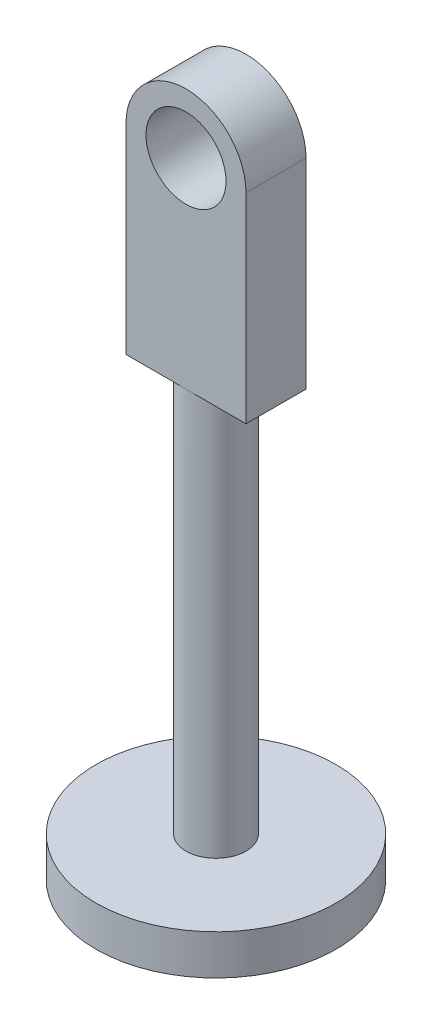
ISO-10303-21;
HEADER;
FILE_DESCRIPTION(('STEP AP214'),'2;1');
FILE_NAME('part.step','',(''),(''),'','','');
FILE_SCHEMA(('AUTOMOTIVE_DESIGN { 1 0 10303 214 1 1 1 1 }'));
ENDSEC;
DATA;
#1=APPLICATION_CONTEXT('core data for automotive mechanical design processes');
#2=APPLICATION_PROTOCOL_DEFINITION('international standard','automotive_design',2000,#1);
#3=PRODUCT_CONTEXT('',#1,'mechanical');
#4=PRODUCT('Part','Part','',(#3));
#5=PRODUCT_RELATED_PRODUCT_CATEGORY('part','',(#4));
#6=PRODUCT_DEFINITION_FORMATION('','',#4);
#7=PRODUCT_DEFINITION_CONTEXT('part definition',#1,'design');
#8=PRODUCT_DEFINITION('design','',#6,#7);
#9=PRODUCT_DEFINITION_SHAPE('','',#8);
#10=(LENGTH_UNIT() NAMED_UNIT(*) SI_UNIT(.MILLI.,.METRE.));
#11=(NAMED_UNIT(*) PLANE_ANGLE_UNIT() SI_UNIT($,.RADIAN.));
#12=(NAMED_UNIT(*) SI_UNIT($,.STERADIAN.) SOLID_ANGLE_UNIT());
#13=UNCERTAINTY_MEASURE_WITH_UNIT(LENGTH_MEASURE(1.E-05),#10,'distance_accuracy_value','');
#14=(GEOMETRIC_REPRESENTATION_CONTEXT(3) GLOBAL_UNCERTAINTY_ASSIGNED_CONTEXT((#13)) GLOBAL_UNIT_ASSIGNED_CONTEXT((#10,
#11,#12)) REPRESENTATION_CONTEXT('',''));
#15=CARTESIAN_POINT('',(0.,0.,0.));
#16=DIRECTION('',(0.,0.,1.));
#17=DIRECTION('',(1.,0.,0.));
#18=AXIS2_PLACEMENT_3D('',#15,#16,#17);
#19=CARTESIAN_POINT('',(0.,0.,1.5));
#20=DIRECTION('',(0.,1.,0.));
#21=DIRECTION('',(0.,0.,1.));
#22=AXIS2_PLACEMENT_3D('',#19,#20,#21);
#23=PLANE('',#22);
#24=CARTESIAN_POINT('',(3.,0.,0.));
#25=DIRECTION('',(0.,-1.,0.));
#26=DIRECTION('',(0.,0.,-1.));
#27=AXIS2_PLACEMENT_3D('',#24,#25,#26);
#28=CIRCLE('',#27,1.5);
#29=CARTESIAN_POINT('',(3.,0.,-1.5));
#30=VERTEX_POINT('',#29);
#31=CARTESIAN_POINT('',(3.,0.,1.5));
#32=VERTEX_POINT('',#31);
#33=EDGE_CURVE('E45',#30,#32,#28,.T.);
#34=ORIENTED_EDGE('',*,*,#33,.F.);
#35=DIRECTION('',(1.,0.,0.));
#36=VECTOR('',#35,1.);
#37=CARTESIAN_POINT('',(0.,0.,-1.5));
#38=LINE('',#37,#36);
#39=CARTESIAN_POINT('',(6.,0.,-1.5));
#40=VERTEX_POINT('',#39);
#41=EDGE_CURVE('E96',#30,#40,#38,.T.);
#42=ORIENTED_EDGE('',*,*,#41,.T.);
#43=DIRECTION('',(0.,0.,-1.));
#44=VECTOR('',#43,1.);
#45=CARTESIAN_POINT('',(6.,0.,1.5));
#46=LINE('',#45,#44);
#47=CARTESIAN_POINT('',(6.,0.,1.5));
#48=VERTEX_POINT('',#47);
#49=EDGE_CURVE('E162',#48,#40,#46,.T.);
#50=ORIENTED_EDGE('',*,*,#49,.F.);
#51=DIRECTION('',(1.,0.,0.));
#52=VECTOR('',#51,1.);
#53=CARTESIAN_POINT('',(0.,0.,1.5));
#54=LINE('',#53,#52);
#55=EDGE_CURVE('E107',#32,#48,#54,.T.);
#56=ORIENTED_EDGE('',*,*,#55,.F.);
#57=EDGE_LOOP('',(#34,#42,#50,#56));
#58=FACE_BOUND('',#57,.T.);
#59=ADVANCED_FACE('F35',(#58),#23,.F.);
#60=CARTESIAN_POINT('',(3.,10.,1.5));
#61=DIRECTION('',(0.,0.,1.));
#62=DIRECTION('',(1.,0.,0.));
#63=AXIS2_PLACEMENT_3D('',#60,#61,#62);
#64=PLANE('',#63);
#65=DIRECTION('',(0.,-1.,0.));
#66=VECTOR('',#65,1.);
#67=CARTESIAN_POINT('',(0.,0.,1.5));
#68=LINE('',#67,#66);
#69=CARTESIAN_POINT('',(0.,10.,1.5));
#70=VERTEX_POINT('',#69);
#71=CARTESIAN_POINT('',(0.,0.,1.5));
#72=VERTEX_POINT('',#71);
#73=EDGE_CURVE('E159',#70,#72,#68,.T.);
#74=ORIENTED_EDGE('',*,*,#73,.T.);
#75=EDGE_CURVE('E85',#72,#32,#54,.T.);
#76=ORIENTED_EDGE('',*,*,#75,.T.);
#77=ORIENTED_EDGE('',*,*,#55,.T.);
#78=DIRECTION('',(0.,1.,0.));
#79=VECTOR('',#78,1.);
#80=CARTESIAN_POINT('',(6.,0.,1.5));
#81=LINE('',#80,#79);
#82=CARTESIAN_POINT('',(6.,10.,1.5));
#83=VERTEX_POINT('',#82);
#84=EDGE_CURVE('E165',#48,#83,#81,.T.);
#85=ORIENTED_EDGE('',*,*,#84,.T.);
#86=CARTESIAN_POINT('',(3.,10.,1.5));
#87=DIRECTION('',(0.,0.,1.));
#88=DIRECTION('',(1.,0.,0.));
#89=AXIS2_PLACEMENT_3D('',#86,#87,#88);
#90=CIRCLE('',#89,3.);
#91=EDGE_CURVE('E59',#83,#70,#90,.T.);
#92=ORIENTED_EDGE('',*,*,#91,.T.);
#93=EDGE_LOOP('',(#74,#76,#77,#85,#92));
#94=FACE_BOUND('',#93,.T.);
#95=CARTESIAN_POINT('',(3.,10.,1.5));
#96=DIRECTION('',(0.,0.,1.));
#97=DIRECTION('',(1.,0.,0.));
#98=AXIS2_PLACEMENT_3D('',#95,#96,#97);
#99=CIRCLE('',#98,2.);
#100=CARTESIAN_POINT('',(5.,10.,1.5));
#101=VERTEX_POINT('',#100);
#102=EDGE_CURVE('E149',#101,#101,#99,.T.);
#103=ORIENTED_EDGE('',*,*,#102,.F.);
#104=EDGE_LOOP('',(#103));
#105=FACE_BOUND('',#104,.T.);
#106=ADVANCED_FACE('F129',(#94,#105),#64,.T.);
#107=CARTESIAN_POINT('',(3.,10.,-1.5));
#108=DIRECTION('',(0.,0.,1.));
#109=DIRECTION('',(1.,0.,0.));
#110=AXIS2_PLACEMENT_3D('',#107,#108,#109);
#111=PLANE('',#110);
#112=DIRECTION('',(0.,-1.,0.));
#113=VECTOR('',#112,1.);
#114=CARTESIAN_POINT('',(0.,0.,-1.5));
#115=LINE('',#114,#113);
#116=CARTESIAN_POINT('',(0.,10.,-1.5));
#117=VERTEX_POINT('',#116);
#118=CARTESIAN_POINT('',(0.,0.,-1.5));
#119=VERTEX_POINT('',#118);
#120=EDGE_CURVE('E105',#117,#119,#115,.T.);
#121=ORIENTED_EDGE('',*,*,#120,.F.);
#122=CARTESIAN_POINT('',(3.,10.,-1.5));
#123=DIRECTION('',(0.,0.,1.));
#124=DIRECTION('',(1.,0.,0.));
#125=AXIS2_PLACEMENT_3D('',#122,#123,#124);
#126=CIRCLE('',#125,3.);
#127=CARTESIAN_POINT('',(6.,10.,-1.5));
#128=VERTEX_POINT('',#127);
#129=EDGE_CURVE('E80',#128,#117,#126,.T.);
#130=ORIENTED_EDGE('',*,*,#129,.F.);
#131=DIRECTION('',(0.,1.,0.));
#132=VECTOR('',#131,1.);
#133=CARTESIAN_POINT('',(6.,0.,-1.5));
#134=LINE('',#133,#132);
#135=EDGE_CURVE('E95',#40,#128,#134,.T.);
#136=ORIENTED_EDGE('',*,*,#135,.F.);
#137=ORIENTED_EDGE('',*,*,#41,.F.);
#138=EDGE_CURVE('E88',#119,#30,#38,.T.);
#139=ORIENTED_EDGE('',*,*,#138,.F.);
#140=EDGE_LOOP('',(#121,#130,#136,#137,#139));
#141=FACE_BOUND('',#140,.T.);
#142=CARTESIAN_POINT('',(3.,10.,-1.5));
#143=DIRECTION('',(0.,0.,1.));
#144=DIRECTION('',(1.,0.,0.));
#145=AXIS2_PLACEMENT_3D('',#142,#143,#144);
#146=CIRCLE('',#145,2.);
#147=CARTESIAN_POINT('',(5.,10.,-1.5));
#148=VERTEX_POINT('',#147);
#149=EDGE_CURVE('E152',#148,#148,#146,.T.);
#150=ORIENTED_EDGE('',*,*,#149,.T.);
#151=EDGE_LOOP('',(#150));
#152=FACE_BOUND('',#151,.T.);
#153=ADVANCED_FACE('F100',(#141,#152),#111,.F.);
#154=CARTESIAN_POINT('',(0.,0.,1.5));
#155=DIRECTION('',(1.,0.,0.));
#156=DIRECTION('',(0.,0.,-1.));
#157=AXIS2_PLACEMENT_3D('',#154,#155,#156);
#158=PLANE('',#157);
#159=ORIENTED_EDGE('',*,*,#120,.T.);
#160=DIRECTION('',(0.,0.,-1.));
#161=VECTOR('',#160,1.);
#162=CARTESIAN_POINT('',(0.,0.,1.5));
#163=LINE('',#162,#161);
#164=EDGE_CURVE('E39',#72,#119,#163,.T.);
#165=ORIENTED_EDGE('',*,*,#164,.F.);
#166=ORIENTED_EDGE('',*,*,#73,.F.);
#167=DIRECTION('',(0.,0.,-1.));
#168=VECTOR('',#167,1.);
#169=CARTESIAN_POINT('',(0.,10.,1.5));
#170=LINE('',#169,#168);
#171=EDGE_CURVE('E148',#70,#117,#170,.T.);
#172=ORIENTED_EDGE('',*,*,#171,.T.);
#173=EDGE_LOOP('',(#159,#165,#166,#172));
#174=FACE_BOUND('',#173,.T.);
#175=ADVANCED_FACE('F37',(#174),#158,.F.);
#176=EDGE_CURVE('E11',#32,#30,#28,.T.);
#177=ORIENTED_EDGE('',*,*,#176,.F.);
#178=ORIENTED_EDGE('',*,*,#75,.F.);
#179=ORIENTED_EDGE('',*,*,#164,.T.);
#180=ORIENTED_EDGE('',*,*,#138,.T.);
#181=EDGE_LOOP('',(#177,#178,#179,#180));
#182=FACE_BOUND('',#181,.T.);
#183=ADVANCED_FACE('F90',(#182),#23,.F.);
#184=CARTESIAN_POINT('',(6.,0.,1.5));
#185=DIRECTION('',(-1.,0.,0.));
#186=DIRECTION('',(0.,0.,1.));
#187=AXIS2_PLACEMENT_3D('',#184,#185,#186);
#188=PLANE('',#187);
#189=ORIENTED_EDGE('',*,*,#135,.T.);
#190=DIRECTION('',(0.,0.,-1.));
#191=VECTOR('',#190,1.);
#192=CARTESIAN_POINT('',(6.,10.,1.5));
#193=LINE('',#192,#191);
#194=EDGE_CURVE('E161',#83,#128,#193,.T.);
#195=ORIENTED_EDGE('',*,*,#194,.F.);
#196=ORIENTED_EDGE('',*,*,#84,.F.);
#197=ORIENTED_EDGE('',*,*,#49,.T.);
#198=EDGE_LOOP('',(#189,#195,#196,#197));
#199=FACE_BOUND('',#198,.T.);
#200=ADVANCED_FACE('F136',(#199),#188,.F.);
#201=CARTESIAN_POINT('',(3.,10.,1.5));
#202=DIRECTION('',(0.,0.,-1.));
#203=DIRECTION('',(-1.,0.,0.));
#204=AXIS2_PLACEMENT_3D('',#201,#202,#203);
#205=CYLINDRICAL_SURFACE('',#204,3.);
#206=ORIENTED_EDGE('',*,*,#129,.T.);
#207=ORIENTED_EDGE('',*,*,#171,.F.);
#208=ORIENTED_EDGE('',*,*,#91,.F.);
#209=ORIENTED_EDGE('',*,*,#194,.T.);
#210=EDGE_LOOP('',(#206,#207,#208,#209));
#211=FACE_BOUND('',#210,.T.);
#212=ADVANCED_FACE('F124',(#211),#205,.T.);
#213=CARTESIAN_POINT('',(3.,10.,1.5));
#214=DIRECTION('',(0.,0.,-1.));
#215=DIRECTION('',(-1.,0.,0.));
#216=AXIS2_PLACEMENT_3D('',#213,#214,#215);
#217=CYLINDRICAL_SURFACE('',#216,2.);
#218=ORIENTED_EDGE('',*,*,#102,.T.);
#219=EDGE_LOOP('',(#218));
#220=FACE_BOUND('',#219,.T.);
#221=ORIENTED_EDGE('',*,*,#149,.F.);
#222=EDGE_LOOP('',(#221));
#223=FACE_BOUND('',#222,.T.);
#224=ADVANCED_FACE('F114',(#220,#223),#217,.F.);
#225=CARTESIAN_POINT('',(3.,-20.,0.));
#226=DIRECTION('',(0.,1.,0.));
#227=DIRECTION('',(0.,0.,1.));
#228=AXIS2_PLACEMENT_3D('',#225,#226,#227);
#229=CYLINDRICAL_SURFACE('',#228,1.5);
#230=CARTESIAN_POINT('',(3.,-20.,0.));
#231=DIRECTION('',(0.,-1.,0.));
#232=DIRECTION('',(0.,0.,-1.));
#233=AXIS2_PLACEMENT_3D('',#230,#231,#232);
#234=CIRCLE('',#233,1.5);
#235=CARTESIAN_POINT('',(3.,-20.,-1.5));
#236=VERTEX_POINT('',#235);
#237=EDGE_CURVE('E109',#236,#236,#234,.T.);
#238=ORIENTED_EDGE('',*,*,#237,.F.);
#239=EDGE_LOOP('',(#238));
#240=FACE_BOUND('',#239,.T.);
#241=ORIENTED_EDGE('',*,*,#33,.T.);
#242=ORIENTED_EDGE('',*,*,#176,.T.);
#243=EDGE_LOOP('',(#241,#242));
#244=FACE_BOUND('',#243,.T.);
#245=ADVANCED_FACE('F111',(#240,#244),#229,.T.);
#246=CARTESIAN_POINT('',(3.,-22.,0.));
#247=DIRECTION('',(0.,1.,0.));
#248=DIRECTION('',(0.,0.,1.));
#249=AXIS2_PLACEMENT_3D('',#246,#247,#248);
#250=CYLINDRICAL_SURFACE('',#249,6.);
#251=CARTESIAN_POINT('',(3.,-22.,0.));
#252=DIRECTION('',(0.,-1.,0.));
#253=DIRECTION('',(0.,0.,-1.));
#254=AXIS2_PLACEMENT_3D('',#251,#252,#253);
#255=CIRCLE('',#254,6.);
#256=CARTESIAN_POINT('',(3.,-22.,-6.));
#257=VERTEX_POINT('',#256);
#258=EDGE_CURVE('E110',#257,#257,#255,.T.);
#259=ORIENTED_EDGE('',*,*,#258,.F.);
#260=EDGE_LOOP('',(#259));
#261=FACE_BOUND('',#260,.T.);
#262=CARTESIAN_POINT('',(3.,-20.,0.));
#263=DIRECTION('',(0.,-1.,0.));
#264=DIRECTION('',(0.,0.,-1.));
#265=AXIS2_PLACEMENT_3D('',#262,#263,#264);
#266=CIRCLE('',#265,6.);
#267=CARTESIAN_POINT('',(3.,-20.,-6.));
#268=VERTEX_POINT('',#267);
#269=EDGE_CURVE('E173',#268,#268,#266,.T.);
#270=ORIENTED_EDGE('',*,*,#269,.T.);
#271=EDGE_LOOP('',(#270));
#272=FACE_BOUND('',#271,.T.);
#273=ADVANCED_FACE('F113',(#261,#272),#250,.T.);
#274=CARTESIAN_POINT('',(3.,-22.,0.));
#275=DIRECTION('',(0.,-1.,0.));
#276=DIRECTION('',(0.,0.,-1.));
#277=AXIS2_PLACEMENT_3D('',#274,#275,#276);
#278=PLANE('',#277);
#279=ORIENTED_EDGE('',*,*,#258,.T.);
#280=EDGE_LOOP('',(#279));
#281=FACE_BOUND('',#280,.T.);
#282=ADVANCED_FACE('F121',(#281),#278,.T.);
#283=CARTESIAN_POINT('',(3.,-20.,0.));
#284=DIRECTION('',(0.,-1.,0.));
#285=DIRECTION('',(0.,0.,-1.));
#286=AXIS2_PLACEMENT_3D('',#283,#284,#285);
#287=PLANE('',#286);
#288=ORIENTED_EDGE('',*,*,#237,.T.);
#289=EDGE_LOOP('',(#288));
#290=FACE_BOUND('',#289,.T.);
#291=ORIENTED_EDGE('',*,*,#269,.F.);
#292=EDGE_LOOP('',(#291));
#293=FACE_BOUND('',#292,.T.);
#294=ADVANCED_FACE('F182',(#290,#293),#287,.F.);
#295=CLOSED_SHELL('',(#59,#106,#153,#175,#183,#200,#212,#224,#245,#273,#282,#294));
#296=MANIFOLD_SOLID_BREP('B2',#295);
#297=ADVANCED_BREP_SHAPE_REPRESENTATION('',(#18,#296),#14);
#298=SHAPE_DEFINITION_REPRESENTATION(#9,#297);
ENDSEC;
END-ISO-10303-21;
